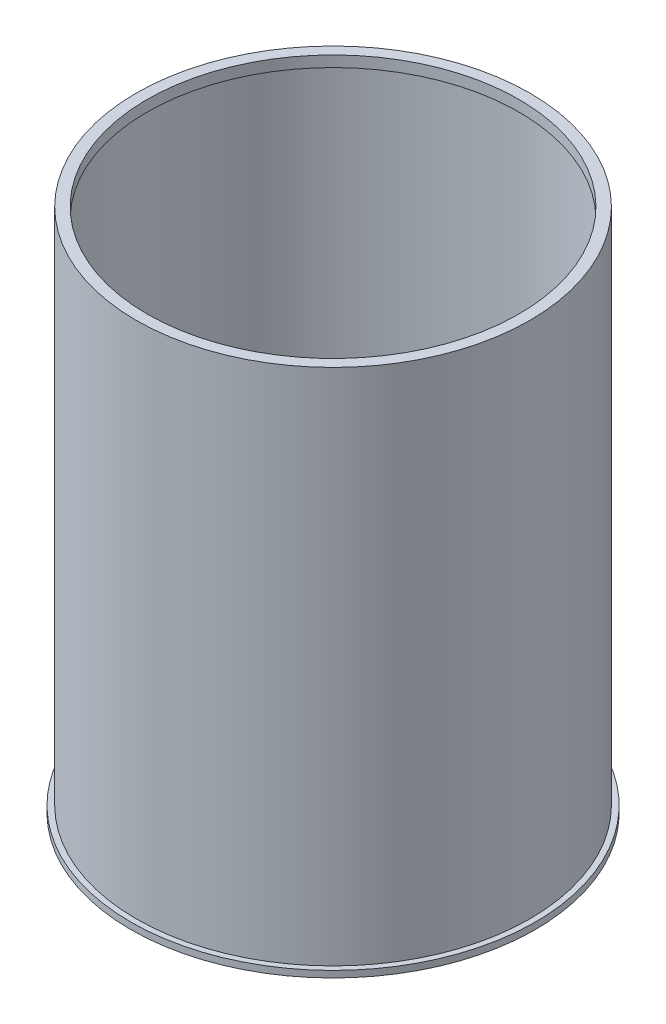
ISO-10303-21;
HEADER;
FILE_DESCRIPTION(('STEP AP214'),'2;1');
FILE_NAME('part.step','',(''),(''),'','','');
FILE_SCHEMA(('AUTOMOTIVE_DESIGN { 1 0 10303 214 1 1 1 1 }'));
ENDSEC;
DATA;
#1=APPLICATION_CONTEXT('core data for automotive mechanical design processes');
#2=APPLICATION_PROTOCOL_DEFINITION('international standard','automotive_design',2000,#1);
#3=PRODUCT_CONTEXT('',#1,'mechanical');
#4=PRODUCT('Part','Part','',(#3));
#5=PRODUCT_RELATED_PRODUCT_CATEGORY('part','',(#4));
#6=PRODUCT_DEFINITION_FORMATION('','',#4);
#7=PRODUCT_DEFINITION_CONTEXT('part definition',#1,'design');
#8=PRODUCT_DEFINITION('design','',#6,#7);
#9=PRODUCT_DEFINITION_SHAPE('','',#8);
#10=(LENGTH_UNIT() NAMED_UNIT(*) SI_UNIT(.MILLI.,.METRE.));
#11=(NAMED_UNIT(*) PLANE_ANGLE_UNIT() SI_UNIT($,.RADIAN.));
#12=(NAMED_UNIT(*) SI_UNIT($,.STERADIAN.) SOLID_ANGLE_UNIT());
#13=UNCERTAINTY_MEASURE_WITH_UNIT(LENGTH_MEASURE(1.E-05),#10,'distance_accuracy_value','');
#14=(GEOMETRIC_REPRESENTATION_CONTEXT(3) GLOBAL_UNCERTAINTY_ASSIGNED_CONTEXT((#13)) GLOBAL_UNIT_ASSIGNED_CONTEXT((#10,
#11,#12)) REPRESENTATION_CONTEXT('',''));
#15=CARTESIAN_POINT('',(0.,0.,0.));
#16=DIRECTION('',(0.,0.,1.));
#17=DIRECTION('',(1.,0.,0.));
#18=AXIS2_PLACEMENT_3D('',#15,#16,#17);
#19=CARTESIAN_POINT('',(0.,480.,0.));
#20=DIRECTION('',(0.,-1.,0.));
#21=DIRECTION('',(0.,0.,-1.));
#22=AXIS2_PLACEMENT_3D('',#19,#20,#21);
#23=CYLINDRICAL_SURFACE('',#22,176.);
#24=CARTESIAN_POINT('',(0.,6.00000000000001,0.));
#25=DIRECTION('',(0.,1.,0.));
#26=DIRECTION('',(0.,0.,1.));
#27=AXIS2_PLACEMENT_3D('',#24,#25,#26);
#28=CIRCLE('',#27,176.);
#29=CARTESIAN_POINT('',(0.,6.00000000000001,176.));
#30=VERTEX_POINT('',#29);
#31=EDGE_CURVE('E10',#30,#30,#28,.F.);
#32=ORIENTED_EDGE('',*,*,#31,.T.);
#33=EDGE_LOOP('',(#32));
#34=FACE_BOUND('',#33,.T.);
#35=CARTESIAN_POINT('',(0.,470.,0.));
#36=DIRECTION('',(0.,1.,0.));
#37=DIRECTION('',(0.,0.,1.));
#38=AXIS2_PLACEMENT_3D('',#35,#36,#37);
#39=CIRCLE('',#38,176.);
#40=CARTESIAN_POINT('',(0.,470.,176.));
#41=VERTEX_POINT('',#40);
#42=EDGE_CURVE('E44',#41,#41,#39,.T.);
#43=ORIENTED_EDGE('',*,*,#42,.T.);
#44=EDGE_LOOP('',(#43));
#45=FACE_BOUND('',#44,.T.);
#46=ADVANCED_FACE('F41',(#34,#45),#23,.F.);
#47=CARTESIAN_POINT('',(0.,6.,0.));
#48=DIRECTION('',(0.,1.,0.));
#49=DIRECTION('',(0.,0.,1.));
#50=AXIS2_PLACEMENT_3D('',#47,#48,#49);
#51=PLANE('',#50);
#52=CARTESIAN_POINT('',(0.,6.,0.));
#53=DIRECTION('',(0.,1.,0.));
#54=DIRECTION('',(0.,0.,1.));
#55=AXIS2_PLACEMENT_3D('',#52,#53,#54);
#56=CIRCLE('',#55,12.5);
#57=CARTESIAN_POINT('',(0.,6.,12.5));
#58=VERTEX_POINT('',#57);
#59=EDGE_CURVE('E61',#58,#58,#56,.T.);
#60=ORIENTED_EDGE('',*,*,#59,.F.);
#61=EDGE_LOOP('',(#60));
#62=FACE_BOUND('',#61,.T.);
#63=ORIENTED_EDGE('',*,*,#31,.F.);
#64=EDGE_LOOP('',(#63));
#65=FACE_BOUND('',#64,.T.);
#66=ADVANCED_FACE('F92',(#62,#65),#51,.T.);
#67=CARTESIAN_POINT('',(0.,6.00000000000001,0.));
#68=DIRECTION('',(0.,1.,0.));
#69=DIRECTION('',(0.,0.,1.));
#70=AXIS2_PLACEMENT_3D('',#67,#68,#69);
#71=CIRCLE('',#70,180.);
#72=CARTESIAN_POINT('',(0.,6.00000000000001,180.));
#73=VERTEX_POINT('',#72);
#74=EDGE_CURVE('E58',#73,#73,#71,.F.);
#75=ORIENTED_EDGE('',*,*,#74,.T.);
#76=EDGE_LOOP('',(#75));
#77=FACE_BOUND('',#76,.T.);
#78=CARTESIAN_POINT('',(0.,6.,0.));
#79=DIRECTION('',(0.,1.,0.));
#80=DIRECTION('',(0.,0.,1.));
#81=AXIS2_PLACEMENT_3D('',#78,#79,#80);
#82=CIRCLE('',#81,185.);
#83=CARTESIAN_POINT('',(0.,6.,185.));
#84=VERTEX_POINT('',#83);
#85=EDGE_CURVE('E47',#84,#84,#82,.T.);
#86=ORIENTED_EDGE('',*,*,#85,.T.);
#87=EDGE_LOOP('',(#86));
#88=FACE_BOUND('',#87,.T.);
#89=ADVANCED_FACE('F73',(#77,#88),#51,.T.);
#90=CARTESIAN_POINT('',(0.,0.,0.));
#91=DIRECTION('',(0.,1.,0.));
#92=DIRECTION('',(0.,0.,1.));
#93=AXIS2_PLACEMENT_3D('',#90,#91,#92);
#94=PLANE('',#93);
#95=CARTESIAN_POINT('',(0.,0.,0.));
#96=DIRECTION('',(0.,1.,0.));
#97=DIRECTION('',(0.,0.,1.));
#98=AXIS2_PLACEMENT_3D('',#95,#96,#97);
#99=CIRCLE('',#98,185.);
#100=CARTESIAN_POINT('',(0.,0.,185.));
#101=VERTEX_POINT('',#100);
#102=EDGE_CURVE('E53',#101,#101,#99,.T.);
#103=ORIENTED_EDGE('',*,*,#102,.F.);
#104=EDGE_LOOP('',(#103));
#105=FACE_BOUND('',#104,.T.);
#106=CARTESIAN_POINT('',(0.,0.,0.));
#107=DIRECTION('',(0.,1.,0.));
#108=DIRECTION('',(0.,0.,1.));
#109=AXIS2_PLACEMENT_3D('',#106,#107,#108);
#110=CIRCLE('',#109,12.5);
#111=CARTESIAN_POINT('',(0.,0.,12.5));
#112=VERTEX_POINT('',#111);
#113=EDGE_CURVE('E64',#112,#112,#110,.T.);
#114=ORIENTED_EDGE('',*,*,#113,.T.);
#115=EDGE_LOOP('',(#114));
#116=FACE_BOUND('',#115,.T.);
#117=ADVANCED_FACE('F75',(#105,#116),#94,.F.);
#118=CARTESIAN_POINT('',(0.,6.,0.));
#119=DIRECTION('',(0.,-1.,0.));
#120=DIRECTION('',(0.,0.,-1.));
#121=AXIS2_PLACEMENT_3D('',#118,#119,#120);
#122=CYLINDRICAL_SURFACE('',#121,185.);
#123=ORIENTED_EDGE('',*,*,#85,.F.);
#124=EDGE_LOOP('',(#123));
#125=FACE_BOUND('',#124,.T.);
#126=ORIENTED_EDGE('',*,*,#102,.T.);
#127=EDGE_LOOP('',(#126));
#128=FACE_BOUND('',#127,.T.);
#129=ADVANCED_FACE('F43',(#125,#128),#122,.T.);
#130=CARTESIAN_POINT('',(0.,6.,0.));
#131=DIRECTION('',(0.,-1.,0.));
#132=DIRECTION('',(0.,0.,-1.));
#133=AXIS2_PLACEMENT_3D('',#130,#131,#132);
#134=CYLINDRICAL_SURFACE('',#133,12.5);
#135=ORIENTED_EDGE('',*,*,#59,.T.);
#136=EDGE_LOOP('',(#135));
#137=FACE_BOUND('',#136,.T.);
#138=ORIENTED_EDGE('',*,*,#113,.F.);
#139=EDGE_LOOP('',(#138));
#140=FACE_BOUND('',#139,.T.);
#141=ADVANCED_FACE('F79',(#137,#140),#134,.F.);
#142=CARTESIAN_POINT('',(0.,480.,0.));
#143=DIRECTION('',(0.,1.,0.));
#144=DIRECTION('',(0.,0.,1.));
#145=AXIS2_PLACEMENT_3D('',#142,#143,#144);
#146=PLANE('',#145);
#147=CARTESIAN_POINT('',(0.,480.,0.));
#148=DIRECTION('',(0.,1.,0.));
#149=DIRECTION('',(0.,0.,1.));
#150=AXIS2_PLACEMENT_3D('',#147,#148,#149);
#151=CIRCLE('',#150,180.);
#152=CARTESIAN_POINT('',(0.,480.,180.));
#153=VERTEX_POINT('',#152);
#154=EDGE_CURVE('E59',#153,#153,#151,.T.);
#155=ORIENTED_EDGE('',*,*,#154,.T.);
#156=EDGE_LOOP('',(#155));
#157=FACE_BOUND('',#156,.T.);
#158=CARTESIAN_POINT('',(0.,480.,0.));
#159=DIRECTION('',(0.,1.,0.));
#160=DIRECTION('',(0.,0.,1.));
#161=AXIS2_PLACEMENT_3D('',#158,#159,#160);
#162=CIRCLE('',#161,170.);
#163=CARTESIAN_POINT('',(0.,480.,170.));
#164=VERTEX_POINT('',#163);
#165=EDGE_CURVE('E117',#164,#164,#162,.T.);
#166=ORIENTED_EDGE('',*,*,#165,.F.);
#167=EDGE_LOOP('',(#166));
#168=FACE_BOUND('',#167,.T.);
#169=ADVANCED_FACE('F78',(#157,#168),#146,.T.);
#170=CARTESIAN_POINT('',(0.,480.,0.));
#171=DIRECTION('',(0.,-1.,0.));
#172=DIRECTION('',(0.,0.,-1.));
#173=AXIS2_PLACEMENT_3D('',#170,#171,#172);
#174=CYLINDRICAL_SURFACE('',#173,180.);
#175=ORIENTED_EDGE('',*,*,#74,.F.);
#176=EDGE_LOOP('',(#175));
#177=FACE_BOUND('',#176,.T.);
#178=ORIENTED_EDGE('',*,*,#154,.F.);
#179=EDGE_LOOP('',(#178));
#180=FACE_BOUND('',#179,.T.);
#181=ADVANCED_FACE('F86',(#177,#180),#174,.T.);
#182=CARTESIAN_POINT('',(0.,470.,0.));
#183=DIRECTION('',(0.,1.,0.));
#184=DIRECTION('',(0.,0.,1.));
#185=AXIS2_PLACEMENT_3D('',#182,#183,#184);
#186=PLANE('',#185);
#187=CARTESIAN_POINT('',(0.,470.,0.));
#188=DIRECTION('',(0.,1.,0.));
#189=DIRECTION('',(0.,0.,1.));
#190=AXIS2_PLACEMENT_3D('',#187,#188,#189);
#191=CIRCLE('',#190,170.);
#192=CARTESIAN_POINT('',(0.,470.,170.));
#193=VERTEX_POINT('',#192);
#194=EDGE_CURVE('E116',#193,#193,#191,.T.);
#195=ORIENTED_EDGE('',*,*,#194,.T.);
#196=EDGE_LOOP('',(#195));
#197=FACE_BOUND('',#196,.T.);
#198=ORIENTED_EDGE('',*,*,#42,.F.);
#199=EDGE_LOOP('',(#198));
#200=FACE_BOUND('',#199,.T.);
#201=ADVANCED_FACE('F103',(#197,#200),#186,.F.);
#202=CARTESIAN_POINT('',(0.,480.,0.));
#203=DIRECTION('',(0.,-1.,0.));
#204=DIRECTION('',(0.,0.,-1.));
#205=AXIS2_PLACEMENT_3D('',#202,#203,#204);
#206=CYLINDRICAL_SURFACE('',#205,170.);
#207=ORIENTED_EDGE('',*,*,#165,.T.);
#208=EDGE_LOOP('',(#207));
#209=FACE_BOUND('',#208,.T.);
#210=ORIENTED_EDGE('',*,*,#194,.F.);
#211=EDGE_LOOP('',(#210));
#212=FACE_BOUND('',#211,.T.);
#213=ADVANCED_FACE('F108',(#209,#212),#206,.F.);
#214=CLOSED_SHELL('',(#46,#66,#89,#117,#129,#141,#169,#181,#201,#213));
#215=MANIFOLD_SOLID_BREP('B2',#214);
#216=ADVANCED_BREP_SHAPE_REPRESENTATION('',(#18,#215),#14);
#217=SHAPE_DEFINITION_REPRESENTATION(#9,#216);
ENDSEC;
END-ISO-10303-21;
